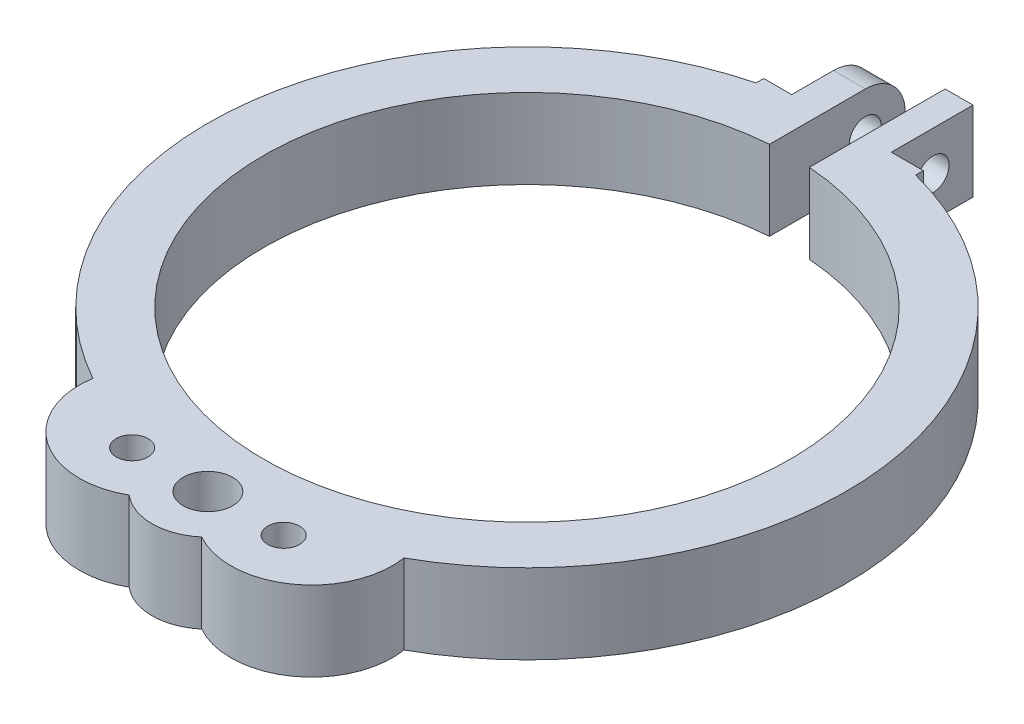
ISO-10303-21;
HEADER;
FILE_DESCRIPTION(('STEP AP214'),'2;1');
FILE_NAME('part.step','',(''),(''),'','','');
FILE_SCHEMA(('AUTOMOTIVE_DESIGN { 1 0 10303 214 1 1 1 1 }'));
ENDSEC;
DATA;
#1=APPLICATION_CONTEXT('core data for automotive mechanical design processes');
#2=APPLICATION_PROTOCOL_DEFINITION('international standard','automotive_design',2000,#1);
#3=PRODUCT_CONTEXT('',#1,'mechanical');
#4=PRODUCT('Part','Part','',(#3));
#5=PRODUCT_RELATED_PRODUCT_CATEGORY('part','',(#4));
#6=PRODUCT_DEFINITION_FORMATION('','',#4);
#7=PRODUCT_DEFINITION_CONTEXT('part definition',#1,'design');
#8=PRODUCT_DEFINITION('design','',#6,#7);
#9=PRODUCT_DEFINITION_SHAPE('','',#8);
#10=(LENGTH_UNIT() NAMED_UNIT(*) SI_UNIT(.MILLI.,.METRE.));
#11=(NAMED_UNIT(*) PLANE_ANGLE_UNIT() SI_UNIT($,.RADIAN.));
#12=(NAMED_UNIT(*) SI_UNIT($,.STERADIAN.) SOLID_ANGLE_UNIT());
#13=UNCERTAINTY_MEASURE_WITH_UNIT(LENGTH_MEASURE(1.E-05),#10,'distance_accuracy_value','');
#14=(GEOMETRIC_REPRESENTATION_CONTEXT(3) GLOBAL_UNCERTAINTY_ASSIGNED_CONTEXT((#13)) GLOBAL_UNIT_ASSIGNED_CONTEXT((#10,
#11,#12)) REPRESENTATION_CONTEXT('',''));
#15=CARTESIAN_POINT('',(0.,0.,0.));
#16=DIRECTION('',(0.,0.,1.));
#17=DIRECTION('',(1.,0.,0.));
#18=AXIS2_PLACEMENT_3D('',#15,#16,#17);
#19=CARTESIAN_POINT('',(0.,10.,-39.6862696659689));
#20=DIRECTION('',(0.,0.,-1.));
#21=DIRECTION('',(-1.,0.,0.));
#22=AXIS2_PLACEMENT_3D('',#19,#20,#21);
#23=PLANE('',#22);
#24=DIRECTION('',(1.,0.,0.));
#25=VECTOR('',#24,1.);
#26=CARTESIAN_POINT('',(0.,0.,-39.6862696659689));
#27=LINE('',#26,#25);
#28=CARTESIAN_POINT('',(6.,0.,-39.6862696659689));
#29=VERTEX_POINT('',#28);
#30=CARTESIAN_POINT('',(10.,0.,-39.6862696659689));
#31=VERTEX_POINT('',#30);
#32=EDGE_CURVE('E151',#29,#31,#27,.T.);
#33=ORIENTED_EDGE('',*,*,#32,.F.);
#34=DIRECTION('',(0.,-1.,0.));
#35=VECTOR('',#34,1.);
#36=CARTESIAN_POINT('',(6.,0.,-39.6862696659689));
#37=LINE('',#36,#35);
#38=CARTESIAN_POINT('',(6.,10.,-39.6862696659689));
#39=VERTEX_POINT('',#38);
#40=EDGE_CURVE('E159',#39,#29,#37,.T.);
#41=ORIENTED_EDGE('',*,*,#40,.F.);
#42=DIRECTION('',(1.,0.,0.));
#43=VECTOR('',#42,1.);
#44=CARTESIAN_POINT('',(0.,10.,-39.6862696659689));
#45=LINE('',#44,#43);
#46=CARTESIAN_POINT('',(10.,10.,-39.6862696659689));
#47=VERTEX_POINT('',#46);
#48=EDGE_CURVE('E256',#39,#47,#45,.T.);
#49=ORIENTED_EDGE('',*,*,#48,.T.);
#50=DIRECTION('',(0.,-1.,0.));
#51=VECTOR('',#50,1.);
#52=CARTESIAN_POINT('',(10.,10.,-39.6862696659689));
#53=LINE('',#52,#51);
#54=EDGE_CURVE('E171',#47,#31,#53,.T.);
#55=ORIENTED_EDGE('',*,*,#54,.T.);
#56=EDGE_LOOP('',(#33,#41,#49,#55));
#57=FACE_BOUND('',#56,.T.);
#58=ADVANCED_FACE('F35',(#57),#23,.T.);
#59=CARTESIAN_POINT('',(0.,10.,-39.6862696659689));
#60=DIRECTION('',(0.,0.,1.));
#61=DIRECTION('',(1.,0.,0.));
#62=AXIS2_PLACEMENT_3D('',#59,#60,#61);
#63=PLANE('',#62);
#64=DIRECTION('',(0.,-1.,0.));
#65=VECTOR('',#64,1.);
#66=CARTESIAN_POINT('',(-6.5,10.,-39.6862696659689));
#67=LINE('',#66,#65);
#68=CARTESIAN_POINT('',(-6.5,10.,-39.6862696659689));
#69=VERTEX_POINT('',#68);
#70=CARTESIAN_POINT('',(-6.5,0.,-39.6862696659689));
#71=VERTEX_POINT('',#70);
#72=EDGE_CURVE('E55',#69,#71,#67,.T.);
#73=ORIENTED_EDGE('',*,*,#72,.T.);
#74=DIRECTION('',(-1.,0.,0.));
#75=VECTOR('',#74,1.);
#76=CARTESIAN_POINT('',(0.,0.,-39.6862696659689));
#77=LINE('',#76,#75);
#78=CARTESIAN_POINT('',(-10.,0.,-39.6862696659689));
#79=VERTEX_POINT('',#78);
#80=EDGE_CURVE('E202',#71,#79,#77,.T.);
#81=ORIENTED_EDGE('',*,*,#80,.T.);
#82=DIRECTION('',(0.,-1.,0.));
#83=VECTOR('',#82,1.);
#84=CARTESIAN_POINT('',(-10.,10.,-39.6862696659689));
#85=LINE('',#84,#83);
#86=CARTESIAN_POINT('',(-10.,10.,-39.6862696659689));
#87=VERTEX_POINT('',#86);
#88=EDGE_CURVE('E44',#87,#79,#85,.T.);
#89=ORIENTED_EDGE('',*,*,#88,.F.);
#90=DIRECTION('',(-1.,0.,0.));
#91=VECTOR('',#90,1.);
#92=CARTESIAN_POINT('',(0.,10.,-39.6862696659689));
#93=LINE('',#92,#91);
#94=EDGE_CURVE('E51',#69,#87,#93,.T.);
#95=ORIENTED_EDGE('',*,*,#94,.F.);
#96=EDGE_LOOP('',(#73,#81,#89,#95));
#97=FACE_BOUND('',#96,.T.);
#98=ADVANCED_FACE('F352',(#97),#63,.F.);
#99=CARTESIAN_POINT('',(2.5,10.,0.));
#100=DIRECTION('',(-1.,0.,0.));
#101=DIRECTION('',(0.,0.,1.));
#102=AXIS2_PLACEMENT_3D('',#99,#100,#101);
#103=PLANE('',#102);
#104=DIRECTION('',(0.,0.,-1.));
#105=VECTOR('',#104,1.);
#106=CARTESIAN_POINT('',(2.5,0.,0.));
#107=LINE('',#106,#105);
#108=CARTESIAN_POINT('',(2.5,0.,-32.9051667675458));
#109=VERTEX_POINT('',#108);
#110=CARTESIAN_POINT('',(2.5,0.,-49.9217985566783));
#111=VERTEX_POINT('',#110);
#112=EDGE_CURVE('E173',#109,#111,#107,.T.);
#113=ORIENTED_EDGE('',*,*,#112,.F.);
#114=DIRECTION('',(0.,-1.,0.));
#115=VECTOR('',#114,1.);
#116=CARTESIAN_POINT('',(2.5,10.,-32.9051667675458));
#117=LINE('',#116,#115);
#118=CARTESIAN_POINT('',(2.5,10.,-32.9051667675458));
#119=VERTEX_POINT('',#118);
#120=EDGE_CURVE('E182',#119,#109,#117,.T.);
#121=ORIENTED_EDGE('',*,*,#120,.F.);
#122=DIRECTION('',(0.,0.,-1.));
#123=VECTOR('',#122,1.);
#124=CARTESIAN_POINT('',(2.5,10.,0.));
#125=LINE('',#124,#123);
#126=CARTESIAN_POINT('',(2.5,10.,-49.9217985566783));
#127=VERTEX_POINT('',#126);
#128=EDGE_CURVE('E184',#119,#127,#125,.T.);
#129=ORIENTED_EDGE('',*,*,#128,.T.);
#130=DIRECTION('',(0.,1.,0.));
#131=VECTOR('',#130,1.);
#132=CARTESIAN_POINT('',(2.5,10.,-49.9217985566783));
#133=LINE('',#132,#131);
#134=EDGE_CURVE('E334',#111,#127,#133,.T.);
#135=ORIENTED_EDGE('',*,*,#134,.F.);
#136=EDGE_LOOP('',(#113,#121,#129,#135));
#137=FACE_BOUND('',#136,.T.);
#138=CARTESIAN_POINT('',(2.5,5.,-44.9217985566783));
#139=DIRECTION('',(-1.,0.,0.));
#140=DIRECTION('',(0.,0.,1.));
#141=AXIS2_PLACEMENT_3D('',#138,#139,#140);
#142=CIRCLE('',#141,2.);
#143=CARTESIAN_POINT('',(2.5,5.,-42.9217985566783));
#144=VERTEX_POINT('',#143);
#145=EDGE_CURVE('E39',#144,#144,#142,.F.);
#146=ORIENTED_EDGE('',*,*,#145,.T.);
#147=EDGE_LOOP('',(#146));
#148=FACE_BOUND('',#147,.T.);
#149=ADVANCED_FACE('F357',(#137,#148),#103,.T.);
#150=CARTESIAN_POINT('',(0.,10.,0.));
#151=DIRECTION('',(0.,-1.,0.));
#152=DIRECTION('',(0.,0.,-1.));
#153=AXIS2_PLACEMENT_3D('',#150,#151,#152);
#154=CYLINDRICAL_SURFACE('',#153,40.);
#155=DIRECTION('',(0.,1.,0.));
#156=VECTOR('',#155,1.);
#157=CARTESIAN_POINT('',(-19.5008787346222,0.,34.9244288224956));
#158=LINE('',#157,#156);
#159=CARTESIAN_POINT('',(-19.5008787346222,0.,34.9244288224956));
#160=VERTEX_POINT('',#159);
#161=CARTESIAN_POINT('',(-19.5008787346222,10.,34.9244288224956));
#162=VERTEX_POINT('',#161);
#163=EDGE_CURVE('E214',#160,#162,#158,.T.);
#164=ORIENTED_EDGE('',*,*,#163,.T.);
#165=CARTESIAN_POINT('',(0.,10.,0.));
#166=DIRECTION('',(0.,1.,0.));
#167=DIRECTION('',(0.,0.,1.));
#168=AXIS2_PLACEMENT_3D('',#165,#166,#167);
#169=CIRCLE('',#168,40.);
#170=CARTESIAN_POINT('',(-10.,10.,-38.7298334620742));
#171=VERTEX_POINT('',#170);
#172=EDGE_CURVE('E251',#171,#162,#169,.T.);
#173=ORIENTED_EDGE('',*,*,#172,.F.);
#174=DIRECTION('',(0.,-1.,0.));
#175=VECTOR('',#174,1.);
#176=CARTESIAN_POINT('',(-10.,10.,-38.7298334620742));
#177=LINE('',#176,#175);
#178=CARTESIAN_POINT('',(-10.,0.,-38.7298334620742));
#179=VERTEX_POINT('',#178);
#180=EDGE_CURVE('E189',#171,#179,#177,.T.);
#181=ORIENTED_EDGE('',*,*,#180,.T.);
#182=CARTESIAN_POINT('',(0.,0.,0.));
#183=DIRECTION('',(0.,1.,0.));
#184=DIRECTION('',(0.,0.,1.));
#185=AXIS2_PLACEMENT_3D('',#182,#183,#184);
#186=CIRCLE('',#185,40.);
#187=EDGE_CURVE('E178',#179,#160,#186,.T.);
#188=ORIENTED_EDGE('',*,*,#187,.T.);
#189=EDGE_LOOP('',(#164,#173,#181,#188));
#190=FACE_BOUND('',#189,.T.);
#191=ADVANCED_FACE('F211',(#190),#154,.T.);
#192=CARTESIAN_POINT('',(0.,10.,0.));
#193=DIRECTION('',(0.,-1.,0.));
#194=DIRECTION('',(0.,0.,-1.));
#195=AXIS2_PLACEMENT_3D('',#192,#193,#194);
#196=CYLINDRICAL_SURFACE('',#195,33.);
#197=CARTESIAN_POINT('',(0.,0.,0.));
#198=DIRECTION('',(0.,1.,0.));
#199=DIRECTION('',(0.,0.,1.));
#200=AXIS2_PLACEMENT_3D('',#197,#198,#199);
#201=CIRCLE('',#200,33.);
#202=CARTESIAN_POINT('',(-2.5,0.,-32.9051667675458));
#203=VERTEX_POINT('',#202);
#204=EDGE_CURVE('E229',#203,#109,#201,.T.);
#205=ORIENTED_EDGE('',*,*,#204,.F.);
#206=DIRECTION('',(0.,-1.,0.));
#207=VECTOR('',#206,1.);
#208=CARTESIAN_POINT('',(-2.5,10.,-32.9051667675458));
#209=LINE('',#208,#207);
#210=CARTESIAN_POINT('',(-2.5,10.,-32.9051667675458));
#211=VERTEX_POINT('',#210);
#212=EDGE_CURVE('E11',#211,#203,#209,.T.);
#213=ORIENTED_EDGE('',*,*,#212,.F.);
#214=CARTESIAN_POINT('',(0.,10.,0.));
#215=DIRECTION('',(0.,1.,0.));
#216=DIRECTION('',(0.,0.,1.));
#217=AXIS2_PLACEMENT_3D('',#214,#215,#216);
#218=CIRCLE('',#217,33.);
#219=EDGE_CURVE('E176',#211,#119,#218,.T.);
#220=ORIENTED_EDGE('',*,*,#219,.T.);
#221=ORIENTED_EDGE('',*,*,#120,.T.);
#222=EDGE_LOOP('',(#205,#213,#220,#221));
#223=FACE_BOUND('',#222,.T.);
#224=ADVANCED_FACE('F37',(#223),#196,.F.);
#225=CARTESIAN_POINT('',(-2.5,10.,0.));
#226=DIRECTION('',(-1.,0.,0.));
#227=DIRECTION('',(0.,0.,1.));
#228=AXIS2_PLACEMENT_3D('',#225,#226,#227);
#229=PLANE('',#228);
#230=CARTESIAN_POINT('',(-2.5,5.,-44.9217985566783));
#231=DIRECTION('',(1.,0.,0.));
#232=DIRECTION('',(0.,0.,-1.));
#233=AXIS2_PLACEMENT_3D('',#230,#231,#232);
#234=CIRCLE('',#233,2.);
#235=CARTESIAN_POINT('',(-2.5,5.,-46.9217985566783));
#236=VERTEX_POINT('',#235);
#237=EDGE_CURVE('E278',#236,#236,#234,.T.);
#238=ORIENTED_EDGE('',*,*,#237,.F.);
#239=EDGE_LOOP('',(#238));
#240=FACE_BOUND('',#239,.T.);
#241=DIRECTION('',(0.,0.,-1.));
#242=VECTOR('',#241,1.);
#243=CARTESIAN_POINT('',(-2.5,0.,0.));
#244=LINE('',#243,#242);
#245=CARTESIAN_POINT('',(-2.5,0.,-44.9217985566783));
#246=VERTEX_POINT('',#245);
#247=EDGE_CURVE('E207',#203,#246,#244,.T.);
#248=ORIENTED_EDGE('',*,*,#247,.T.);
#249=CARTESIAN_POINT('',(-2.5,5.,-44.9217985566783));
#250=DIRECTION('',(1.,0.,0.));
#251=DIRECTION('',(0.,0.,-1.));
#252=AXIS2_PLACEMENT_3D('',#249,#250,#251);
#253=CIRCLE('',#252,5.);
#254=CARTESIAN_POINT('',(-2.5,10.,-44.9217985566783));
#255=VERTEX_POINT('',#254);
#256=EDGE_CURVE('E265',#246,#255,#253,.T.);
#257=ORIENTED_EDGE('',*,*,#256,.T.);
#258=DIRECTION('',(0.,0.,-1.));
#259=VECTOR('',#258,1.);
#260=CARTESIAN_POINT('',(-2.5,10.,0.));
#261=LINE('',#260,#259);
#262=EDGE_CURVE('E245',#211,#255,#261,.T.);
#263=ORIENTED_EDGE('',*,*,#262,.F.);
#264=ORIENTED_EDGE('',*,*,#212,.T.);
#265=EDGE_LOOP('',(#248,#257,#263,#264));
#266=FACE_BOUND('',#265,.T.);
#267=ADVANCED_FACE('F263',(#240,#266),#229,.F.);
#268=CARTESIAN_POINT('',(-10.,10.,0.));
#269=DIRECTION('',(1.,0.,0.));
#270=DIRECTION('',(0.,0.,-1.));
#271=AXIS2_PLACEMENT_3D('',#268,#269,#270);
#272=PLANE('',#271);
#273=DIRECTION('',(0.,0.,1.));
#274=VECTOR('',#273,1.);
#275=CARTESIAN_POINT('',(-10.,0.,0.));
#276=LINE('',#275,#274);
#277=EDGE_CURVE('E198',#79,#179,#276,.T.);
#278=ORIENTED_EDGE('',*,*,#277,.T.);
#279=ORIENTED_EDGE('',*,*,#180,.F.);
#280=DIRECTION('',(0.,0.,1.));
#281=VECTOR('',#280,1.);
#282=CARTESIAN_POINT('',(-10.,10.,0.));
#283=LINE('',#282,#281);
#284=EDGE_CURVE('E199',#87,#171,#283,.T.);
#285=ORIENTED_EDGE('',*,*,#284,.F.);
#286=ORIENTED_EDGE('',*,*,#88,.T.);
#287=EDGE_LOOP('',(#278,#279,#285,#286));
#288=FACE_BOUND('',#287,.T.);
#289=ADVANCED_FACE('F196',(#288),#272,.F.);
#290=CARTESIAN_POINT('',(19.5008787346221,10.,34.9244288224956));
#291=VERTEX_POINT('',#290);
#292=CARTESIAN_POINT('',(10.,10.,-38.7298334620742));
#293=VERTEX_POINT('',#292);
#294=EDGE_CURVE('E250',#291,#293,#169,.T.);
#295=ORIENTED_EDGE('',*,*,#294,.F.);
#296=DIRECTION('',(0.,1.,0.));
#297=VECTOR('',#296,1.);
#298=CARTESIAN_POINT('',(19.5008787346221,0.,34.9244288224956));
#299=LINE('',#298,#297);
#300=CARTESIAN_POINT('',(19.5008787346221,0.,34.9244288224956));
#301=VERTEX_POINT('',#300);
#302=EDGE_CURVE('E230',#301,#291,#299,.T.);
#303=ORIENTED_EDGE('',*,*,#302,.F.);
#304=CARTESIAN_POINT('',(10.,0.,-38.7298334620742));
#305=VERTEX_POINT('',#304);
#306=EDGE_CURVE('E205',#301,#305,#186,.T.);
#307=ORIENTED_EDGE('',*,*,#306,.T.);
#308=DIRECTION('',(0.,-1.,0.));
#309=VECTOR('',#308,1.);
#310=CARTESIAN_POINT('',(10.,10.,-38.7298334620742));
#311=LINE('',#310,#309);
#312=EDGE_CURVE('E186',#293,#305,#311,.T.);
#313=ORIENTED_EDGE('',*,*,#312,.F.);
#314=EDGE_LOOP('',(#295,#303,#307,#313));
#315=FACE_BOUND('',#314,.T.);
#316=ADVANCED_FACE('F313',(#315),#154,.T.);
#317=CARTESIAN_POINT('',(10.,10.,0.));
#318=DIRECTION('',(1.,0.,0.));
#319=DIRECTION('',(0.,0.,-1.));
#320=AXIS2_PLACEMENT_3D('',#317,#318,#319);
#321=PLANE('',#320);
#322=DIRECTION('',(0.,0.,1.));
#323=VECTOR('',#322,1.);
#324=CARTESIAN_POINT('',(10.,0.,0.));
#325=LINE('',#324,#323);
#326=EDGE_CURVE('E174',#31,#305,#325,.T.);
#327=ORIENTED_EDGE('',*,*,#326,.F.);
#328=ORIENTED_EDGE('',*,*,#54,.F.);
#329=DIRECTION('',(0.,0.,1.));
#330=VECTOR('',#329,1.);
#331=CARTESIAN_POINT('',(10.,10.,0.));
#332=LINE('',#331,#330);
#333=EDGE_CURVE('E253',#47,#293,#332,.T.);
#334=ORIENTED_EDGE('',*,*,#333,.T.);
#335=ORIENTED_EDGE('',*,*,#312,.T.);
#336=EDGE_LOOP('',(#327,#328,#334,#335));
#337=FACE_BOUND('',#336,.T.);
#338=ADVANCED_FACE('F315',(#337),#321,.T.);
#339=CARTESIAN_POINT('',(0.,10.,0.));
#340=DIRECTION('',(0.,1.,0.));
#341=DIRECTION('',(0.,0.,1.));
#342=AXIS2_PLACEMENT_3D('',#339,#340,#341);
#343=PLANE('',#342);
#344=CARTESIAN_POINT('',(0.,10.,40.));
#345=DIRECTION('',(0.,1.,0.));
#346=DIRECTION('',(0.,0.,1.));
#347=AXIS2_PLACEMENT_3D('',#344,#345,#346);
#348=CIRCLE('',#347,3.1);
#349=CARTESIAN_POINT('',(0.,10.,43.1));
#350=VERTEX_POINT('',#349);
#351=EDGE_CURVE('E272',#350,#350,#348,.T.);
#352=ORIENTED_EDGE('',*,*,#351,.F.);
#353=EDGE_LOOP('',(#352));
#354=FACE_BOUND('',#353,.T.);
#355=CARTESIAN_POINT('',(-9.50000000000001,10.,40.));
#356=DIRECTION('',(0.,1.,0.));
#357=DIRECTION('',(0.,0.,1.));
#358=AXIS2_PLACEMENT_3D('',#355,#356,#357);
#359=CIRCLE('',#358,2.);
#360=CARTESIAN_POINT('',(-9.50000000000001,10.,42.));
#361=VERTEX_POINT('',#360);
#362=EDGE_CURVE('E283',#361,#361,#359,.T.);
#363=ORIENTED_EDGE('',*,*,#362,.F.);
#364=EDGE_LOOP('',(#363));
#365=FACE_BOUND('',#364,.T.);
#366=CARTESIAN_POINT('',(9.5,10.,40.));
#367=DIRECTION('',(0.,1.,0.));
#368=DIRECTION('',(0.,0.,1.));
#369=AXIS2_PLACEMENT_3D('',#366,#367,#368);
#370=CIRCLE('',#369,2.);
#371=CARTESIAN_POINT('',(9.5,10.,42.));
#372=VERTEX_POINT('',#371);
#373=EDGE_CURVE('E288',#372,#372,#370,.T.);
#374=ORIENTED_EDGE('',*,*,#373,.F.);
#375=EDGE_LOOP('',(#374));
#376=FACE_BOUND('',#375,.T.);
#377=ORIENTED_EDGE('',*,*,#219,.F.);
#378=ORIENTED_EDGE('',*,*,#262,.T.);
#379=DIRECTION('',(1.,0.,0.));
#380=VECTOR('',#379,1.);
#381=CARTESIAN_POINT('',(-5.,10.,-44.9217985566783));
#382=LINE('',#381,#380);
#383=CARTESIAN_POINT('',(-6.5,10.,-44.9217985566783));
#384=VERTEX_POINT('',#383);
#385=EDGE_CURVE('E273',#384,#255,#382,.T.);
#386=ORIENTED_EDGE('',*,*,#385,.F.);
#387=DIRECTION('',(0.,0.,1.));
#388=VECTOR('',#387,1.);
#389=CARTESIAN_POINT('',(-6.5,10.,-44.9217985566783));
#390=LINE('',#389,#388);
#391=EDGE_CURVE('E319',#384,#69,#390,.T.);
#392=ORIENTED_EDGE('',*,*,#391,.T.);
#393=ORIENTED_EDGE('',*,*,#94,.T.);
#394=ORIENTED_EDGE('',*,*,#284,.T.);
#395=ORIENTED_EDGE('',*,*,#172,.T.);
#396=CARTESIAN_POINT('',(-9.50000000000001,10.,36.5));
#397=DIRECTION('',(0.,1.,0.));
#398=DIRECTION('',(0.,0.,1.));
#399=AXIS2_PLACEMENT_3D('',#396,#397,#398);
#400=CIRCLE('',#399,10.1242283656583);
#401=CARTESIAN_POINT('',(-4.54146341463415,10.,45.3268292682927));
#402=VERTEX_POINT('',#401);
#403=EDGE_CURVE('E228',#402,#162,#400,.F.);
#404=ORIENTED_EDGE('',*,*,#403,.F.);
#405=CARTESIAN_POINT('',(0.,10.,40.));
#406=DIRECTION('',(0.,1.,0.));
#407=DIRECTION('',(0.,0.,1.));
#408=AXIS2_PLACEMENT_3D('',#405,#406,#407);
#409=CIRCLE('',#408,6.99999999999999);
#410=CARTESIAN_POINT('',(4.54146341463413,10.,45.3268292682927));
#411=VERTEX_POINT('',#410);
#412=EDGE_CURVE('E299',#402,#411,#409,.T.);
#413=ORIENTED_EDGE('',*,*,#412,.T.);
#414=CARTESIAN_POINT('',(9.5,10.,36.5));
#415=DIRECTION('',(0.,1.,0.));
#416=DIRECTION('',(0.,0.,1.));
#417=AXIS2_PLACEMENT_3D('',#414,#415,#416);
#418=CIRCLE('',#417,10.1242283656583);
#419=EDGE_CURVE('E223',#411,#291,#418,.T.);
#420=ORIENTED_EDGE('',*,*,#419,.T.);
#421=ORIENTED_EDGE('',*,*,#294,.T.);
#422=ORIENTED_EDGE('',*,*,#333,.F.);
#423=ORIENTED_EDGE('',*,*,#48,.F.);
#424=DIRECTION('',(0.,0.,1.));
#425=VECTOR('',#424,1.);
#426=CARTESIAN_POINT('',(6.,10.,-39.6862696659689));
#427=LINE('',#426,#425);
#428=CARTESIAN_POINT('',(6.,10.,-49.9217985566783));
#429=VERTEX_POINT('',#428);
#430=EDGE_CURVE('E165',#429,#39,#427,.T.);
#431=ORIENTED_EDGE('',*,*,#430,.F.);
#432=DIRECTION('',(1.,0.,0.));
#433=VECTOR('',#432,1.);
#434=CARTESIAN_POINT('',(5.,10.,-49.9217985566783));
#435=LINE('',#434,#433);
#436=EDGE_CURVE('E318',#127,#429,#435,.T.);
#437=ORIENTED_EDGE('',*,*,#436,.F.);
#438=ORIENTED_EDGE('',*,*,#128,.F.);
#439=EDGE_LOOP('',(#377,#378,#386,#392,#393,#394,#395,#404,#413,#420,#421,#422,#423,#431,#437,#438));
#440=FACE_BOUND('',#439,.T.);
#441=ADVANCED_FACE('F306',(#354,#365,#376,#440),#343,.T.);
#442=CARTESIAN_POINT('',(0.,0.,0.));
#443=DIRECTION('',(0.,1.,0.));
#444=DIRECTION('',(0.,0.,1.));
#445=AXIS2_PLACEMENT_3D('',#442,#443,#444);
#446=PLANE('',#445);
#447=CARTESIAN_POINT('',(0.,0.,40.));
#448=DIRECTION('',(0.,1.,0.));
#449=DIRECTION('',(0.,0.,1.));
#450=AXIS2_PLACEMENT_3D('',#447,#448,#449);
#451=CIRCLE('',#450,3.1);
#452=CARTESIAN_POINT('',(0.,0.,43.1));
#453=VERTEX_POINT('',#452);
#454=EDGE_CURVE('E276',#453,#453,#451,.T.);
#455=ORIENTED_EDGE('',*,*,#454,.T.);
#456=EDGE_LOOP('',(#455));
#457=FACE_BOUND('',#456,.T.);
#458=CARTESIAN_POINT('',(-9.50000000000001,0.,40.));
#459=DIRECTION('',(0.,1.,0.));
#460=DIRECTION('',(0.,0.,1.));
#461=AXIS2_PLACEMENT_3D('',#458,#459,#460);
#462=CIRCLE('',#461,2.);
#463=CARTESIAN_POINT('',(-9.50000000000001,0.,42.));
#464=VERTEX_POINT('',#463);
#465=EDGE_CURVE('E285',#464,#464,#462,.T.);
#466=ORIENTED_EDGE('',*,*,#465,.T.);
#467=EDGE_LOOP('',(#466));
#468=FACE_BOUND('',#467,.T.);
#469=CARTESIAN_POINT('',(9.5,0.,40.));
#470=DIRECTION('',(0.,1.,0.));
#471=DIRECTION('',(0.,0.,1.));
#472=AXIS2_PLACEMENT_3D('',#469,#470,#471);
#473=CIRCLE('',#472,2.);
#474=CARTESIAN_POINT('',(9.5,0.,42.));
#475=VERTEX_POINT('',#474);
#476=EDGE_CURVE('E291',#475,#475,#473,.T.);
#477=ORIENTED_EDGE('',*,*,#476,.T.);
#478=EDGE_LOOP('',(#477));
#479=FACE_BOUND('',#478,.T.);
#480=ORIENTED_EDGE('',*,*,#204,.T.);
#481=ORIENTED_EDGE('',*,*,#112,.T.);
#482=DIRECTION('',(-1.,0.,0.));
#483=VECTOR('',#482,1.);
#484=CARTESIAN_POINT('',(5.,0.,-49.9217985566783));
#485=LINE('',#484,#483);
#486=CARTESIAN_POINT('',(6.,0.,-49.9217985566783));
#487=VERTEX_POINT('',#486);
#488=EDGE_CURVE('E154',#487,#111,#485,.T.);
#489=ORIENTED_EDGE('',*,*,#488,.F.);
#490=DIRECTION('',(0.,0.,-1.));
#491=VECTOR('',#490,1.);
#492=CARTESIAN_POINT('',(6.,0.,-49.9217985566783));
#493=LINE('',#492,#491);
#494=EDGE_CURVE('E145',#29,#487,#493,.T.);
#495=ORIENTED_EDGE('',*,*,#494,.F.);
#496=ORIENTED_EDGE('',*,*,#32,.T.);
#497=ORIENTED_EDGE('',*,*,#326,.T.);
#498=ORIENTED_EDGE('',*,*,#306,.F.);
#499=CARTESIAN_POINT('',(9.5,0.,36.5));
#500=DIRECTION('',(0.,1.,0.));
#501=DIRECTION('',(0.,0.,1.));
#502=AXIS2_PLACEMENT_3D('',#499,#500,#501);
#503=CIRCLE('',#502,10.1242283656583);
#504=CARTESIAN_POINT('',(4.54146341463413,0.,45.3268292682927));
#505=VERTEX_POINT('',#504);
#506=EDGE_CURVE('E242',#505,#301,#503,.T.);
#507=ORIENTED_EDGE('',*,*,#506,.F.);
#508=CARTESIAN_POINT('',(0.,0.,40.));
#509=DIRECTION('',(0.,1.,0.));
#510=DIRECTION('',(0.,0.,1.));
#511=AXIS2_PLACEMENT_3D('',#508,#509,#510);
#512=CIRCLE('',#511,6.99999999999999);
#513=CARTESIAN_POINT('',(-4.54146341463415,0.,45.3268292682927));
#514=VERTEX_POINT('',#513);
#515=EDGE_CURVE('E221',#514,#505,#512,.T.);
#516=ORIENTED_EDGE('',*,*,#515,.F.);
#517=CARTESIAN_POINT('',(-9.50000000000001,0.,36.5));
#518=DIRECTION('',(0.,1.,0.));
#519=DIRECTION('',(0.,0.,1.));
#520=AXIS2_PLACEMENT_3D('',#517,#518,#519);
#521=CIRCLE('',#520,10.1242283656583);
#522=EDGE_CURVE('E218',#514,#160,#521,.F.);
#523=ORIENTED_EDGE('',*,*,#522,.T.);
#524=ORIENTED_EDGE('',*,*,#187,.F.);
#525=ORIENTED_EDGE('',*,*,#277,.F.);
#526=ORIENTED_EDGE('',*,*,#80,.F.);
#527=DIRECTION('',(0.,0.,-1.));
#528=VECTOR('',#527,1.);
#529=CARTESIAN_POINT('',(-6.5,0.,-39.6862696659689));
#530=LINE('',#529,#528);
#531=CARTESIAN_POINT('',(-6.5,0.,-44.9217985566783));
#532=VERTEX_POINT('',#531);
#533=EDGE_CURVE('E268',#71,#532,#530,.T.);
#534=ORIENTED_EDGE('',*,*,#533,.T.);
#535=DIRECTION('',(-1.,0.,0.));
#536=VECTOR('',#535,1.);
#537=CARTESIAN_POINT('',(-5.,0.,-44.9217985566783));
#538=LINE('',#537,#536);
#539=EDGE_CURVE('E267',#246,#532,#538,.T.);
#540=ORIENTED_EDGE('',*,*,#539,.F.);
#541=ORIENTED_EDGE('',*,*,#247,.F.);
#542=EDGE_LOOP('',(#480,#481,#489,#495,#496,#497,#498,#507,#516,#523,#524,#525,#526,#534,#540,#541));
#543=FACE_BOUND('',#542,.T.);
#544=ADVANCED_FACE('F148',(#457,#468,#479,#543),#446,.F.);
#545=CARTESIAN_POINT('',(-9.50000000000001,0.,36.5));
#546=DIRECTION('',(0.,1.,0.));
#547=DIRECTION('',(0.,0.,1.));
#548=AXIS2_PLACEMENT_3D('',#545,#546,#547);
#549=CYLINDRICAL_SURFACE('',#548,10.1242283656583);
#550=ORIENTED_EDGE('',*,*,#403,.T.);
#551=ORIENTED_EDGE('',*,*,#163,.F.);
#552=ORIENTED_EDGE('',*,*,#522,.F.);
#553=DIRECTION('',(0.,1.,0.));
#554=VECTOR('',#553,1.);
#555=CARTESIAN_POINT('',(-4.54146341463415,0.,45.3268292682927));
#556=LINE('',#555,#554);
#557=EDGE_CURVE('E240',#514,#402,#556,.T.);
#558=ORIENTED_EDGE('',*,*,#557,.T.);
#559=EDGE_LOOP('',(#550,#551,#552,#558));
#560=FACE_BOUND('',#559,.T.);
#561=ADVANCED_FACE('F226',(#560),#549,.T.);
#562=CARTESIAN_POINT('',(9.5,0.,36.5));
#563=DIRECTION('',(0.,1.,0.));
#564=DIRECTION('',(0.,0.,1.));
#565=AXIS2_PLACEMENT_3D('',#562,#563,#564);
#566=CYLINDRICAL_SURFACE('',#565,10.1242283656583);
#567=ORIENTED_EDGE('',*,*,#419,.F.);
#568=DIRECTION('',(0.,1.,0.));
#569=VECTOR('',#568,1.);
#570=CARTESIAN_POINT('',(4.54146341463413,0.,45.3268292682927));
#571=LINE('',#570,#569);
#572=EDGE_CURVE('E234',#505,#411,#571,.T.);
#573=ORIENTED_EDGE('',*,*,#572,.F.);
#574=ORIENTED_EDGE('',*,*,#506,.T.);
#575=ORIENTED_EDGE('',*,*,#302,.T.);
#576=EDGE_LOOP('',(#567,#573,#574,#575));
#577=FACE_BOUND('',#576,.T.);
#578=ADVANCED_FACE('F310',(#577),#566,.T.);
#579=CARTESIAN_POINT('',(0.,0.,40.));
#580=DIRECTION('',(0.,1.,0.));
#581=DIRECTION('',(0.,0.,1.));
#582=AXIS2_PLACEMENT_3D('',#579,#580,#581);
#583=CYLINDRICAL_SURFACE('',#582,6.99999999999999);
#584=ORIENTED_EDGE('',*,*,#412,.F.);
#585=ORIENTED_EDGE('',*,*,#557,.F.);
#586=ORIENTED_EDGE('',*,*,#515,.T.);
#587=ORIENTED_EDGE('',*,*,#572,.T.);
#588=EDGE_LOOP('',(#584,#585,#586,#587));
#589=FACE_BOUND('',#588,.T.);
#590=ADVANCED_FACE('F415',(#589),#583,.T.);
#591=CARTESIAN_POINT('',(9.5,0.,40.));
#592=DIRECTION('',(0.,1.,0.));
#593=DIRECTION('',(0.,0.,1.));
#594=AXIS2_PLACEMENT_3D('',#591,#592,#593);
#595=CYLINDRICAL_SURFACE('',#594,2.);
#596=ORIENTED_EDGE('',*,*,#476,.F.);
#597=EDGE_LOOP('',(#596));
#598=FACE_BOUND('',#597,.T.);
#599=ORIENTED_EDGE('',*,*,#373,.T.);
#600=EDGE_LOOP('',(#599));
#601=FACE_BOUND('',#600,.T.);
#602=ADVANCED_FACE('F411',(#598,#601),#595,.F.);
#603=CARTESIAN_POINT('',(-9.50000000000001,0.,40.));
#604=DIRECTION('',(0.,1.,0.));
#605=DIRECTION('',(0.,0.,1.));
#606=AXIS2_PLACEMENT_3D('',#603,#604,#605);
#607=CYLINDRICAL_SURFACE('',#606,2.);
#608=ORIENTED_EDGE('',*,*,#465,.F.);
#609=EDGE_LOOP('',(#608));
#610=FACE_BOUND('',#609,.T.);
#611=ORIENTED_EDGE('',*,*,#362,.T.);
#612=EDGE_LOOP('',(#611));
#613=FACE_BOUND('',#612,.T.);
#614=ADVANCED_FACE('F407',(#610,#613),#607,.F.);
#615=CARTESIAN_POINT('',(0.,0.,40.));
#616=DIRECTION('',(0.,1.,0.));
#617=DIRECTION('',(0.,0.,1.));
#618=AXIS2_PLACEMENT_3D('',#615,#616,#617);
#619=CYLINDRICAL_SURFACE('',#618,3.1);
#620=ORIENTED_EDGE('',*,*,#454,.F.);
#621=EDGE_LOOP('',(#620));
#622=FACE_BOUND('',#621,.T.);
#623=ORIENTED_EDGE('',*,*,#351,.T.);
#624=EDGE_LOOP('',(#623));
#625=FACE_BOUND('',#624,.T.);
#626=ADVANCED_FACE('F404',(#622,#625),#619,.F.);
#627=CARTESIAN_POINT('',(-10.6568542494924,5.,-44.9217985566783));
#628=DIRECTION('',(1.,0.,0.));
#629=DIRECTION('',(0.,0.,-1.));
#630=AXIS2_PLACEMENT_3D('',#627,#628,#629);
#631=CYLINDRICAL_SURFACE('',#630,2.);
#632=ORIENTED_EDGE('',*,*,#237,.T.);
#633=EDGE_LOOP('',(#632));
#634=FACE_BOUND('',#633,.T.);
#635=CARTESIAN_POINT('',(-6.5,5.,-44.9217985566783));
#636=DIRECTION('',(1.,0.,0.));
#637=DIRECTION('',(0.,0.,-1.));
#638=AXIS2_PLACEMENT_3D('',#635,#636,#637);
#639=CIRCLE('',#638,2.);
#640=CARTESIAN_POINT('',(-6.5,5.,-46.9217985566783));
#641=VERTEX_POINT('',#640);
#642=EDGE_CURVE('E326',#641,#641,#639,.T.);
#643=ORIENTED_EDGE('',*,*,#642,.F.);
#644=EDGE_LOOP('',(#643));
#645=FACE_BOUND('',#644,.T.);
#646=ADVANCED_FACE('F340',(#634,#645),#631,.F.);
#647=CARTESIAN_POINT('',(0.,0.,-49.9217985566783));
#648=DIRECTION('',(0.,0.,-1.));
#649=DIRECTION('',(-1.,0.,0.));
#650=AXIS2_PLACEMENT_3D('',#647,#648,#649);
#651=PLANE('',#650);
#652=ORIENTED_EDGE('',*,*,#436,.T.);
#653=DIRECTION('',(0.,1.,0.));
#654=VECTOR('',#653,1.);
#655=CARTESIAN_POINT('',(6.,10.,-49.9217985566783));
#656=LINE('',#655,#654);
#657=EDGE_CURVE('E158',#487,#429,#656,.T.);
#658=ORIENTED_EDGE('',*,*,#657,.F.);
#659=ORIENTED_EDGE('',*,*,#488,.T.);
#660=ORIENTED_EDGE('',*,*,#134,.T.);
#661=EDGE_LOOP('',(#652,#658,#659,#660));
#662=FACE_BOUND('',#661,.T.);
#663=ADVANCED_FACE('F383',(#662),#651,.T.);
#664=CARTESIAN_POINT('',(7.5,5.,-44.9217985566783));
#665=DIRECTION('',(-1.,0.,0.));
#666=DIRECTION('',(0.,0.,1.));
#667=AXIS2_PLACEMENT_3D('',#664,#665,#666);
#668=CYLINDRICAL_SURFACE('',#667,2.);
#669=ORIENTED_EDGE('',*,*,#145,.F.);
#670=EDGE_LOOP('',(#669));
#671=FACE_BOUND('',#670,.T.);
#672=CARTESIAN_POINT('',(6.,5.,-44.9217985566783));
#673=DIRECTION('',(1.,0.,0.));
#674=DIRECTION('',(0.,0.,-1.));
#675=AXIS2_PLACEMENT_3D('',#672,#673,#674);
#676=CIRCLE('',#675,2.);
#677=CARTESIAN_POINT('',(6.,5.,-46.9217985566783));
#678=VERTEX_POINT('',#677);
#679=EDGE_CURVE('E168',#678,#678,#676,.T.);
#680=ORIENTED_EDGE('',*,*,#679,.T.);
#681=EDGE_LOOP('',(#680));
#682=FACE_BOUND('',#681,.T.);
#683=ADVANCED_FACE('F379',(#671,#682),#668,.F.);
#684=CARTESIAN_POINT('',(-6.5,5.,-44.9217985566783));
#685=DIRECTION('',(1.,0.,0.));
#686=DIRECTION('',(0.,0.,-1.));
#687=AXIS2_PLACEMENT_3D('',#684,#685,#686);
#688=CYLINDRICAL_SURFACE('',#687,5.);
#689=CARTESIAN_POINT('',(-6.5,5.,-44.9217985566783));
#690=DIRECTION('',(1.,0.,0.));
#691=DIRECTION('',(0.,0.,-1.));
#692=AXIS2_PLACEMENT_3D('',#689,#690,#691);
#693=CIRCLE('',#692,5.);
#694=EDGE_CURVE('E330',#532,#384,#693,.T.);
#695=ORIENTED_EDGE('',*,*,#694,.T.);
#696=ORIENTED_EDGE('',*,*,#385,.T.);
#697=ORIENTED_EDGE('',*,*,#256,.F.);
#698=ORIENTED_EDGE('',*,*,#539,.T.);
#699=EDGE_LOOP('',(#695,#696,#697,#698));
#700=FACE_BOUND('',#699,.T.);
#701=ADVANCED_FACE('F382',(#700),#688,.T.);
#702=CARTESIAN_POINT('',(-6.5,5.,-44.9217985566783));
#703=DIRECTION('',(1.,0.,0.));
#704=DIRECTION('',(0.,0.,-1.));
#705=AXIS2_PLACEMENT_3D('',#702,#703,#704);
#706=PLANE('',#705);
#707=ORIENTED_EDGE('',*,*,#642,.T.);
#708=EDGE_LOOP('',(#707));
#709=FACE_BOUND('',#708,.T.);
#710=ORIENTED_EDGE('',*,*,#694,.F.);
#711=ORIENTED_EDGE('',*,*,#533,.F.);
#712=ORIENTED_EDGE('',*,*,#72,.F.);
#713=ORIENTED_EDGE('',*,*,#391,.F.);
#714=EDGE_LOOP('',(#710,#711,#712,#713));
#715=FACE_BOUND('',#714,.T.);
#716=ADVANCED_FACE('F389',(#709,#715),#706,.F.);
#717=CARTESIAN_POINT('',(6.,0.,0.));
#718=DIRECTION('',(-1.,0.,0.));
#719=DIRECTION('',(0.,0.,1.));
#720=AXIS2_PLACEMENT_3D('',#717,#718,#719);
#721=PLANE('',#720);
#722=ORIENTED_EDGE('',*,*,#40,.T.);
#723=ORIENTED_EDGE('',*,*,#494,.T.);
#724=ORIENTED_EDGE('',*,*,#657,.T.);
#725=ORIENTED_EDGE('',*,*,#430,.T.);
#726=EDGE_LOOP('',(#722,#723,#724,#725));
#727=FACE_BOUND('',#726,.T.);
#728=ORIENTED_EDGE('',*,*,#679,.F.);
#729=EDGE_LOOP('',(#728));
#730=FACE_BOUND('',#729,.T.);
#731=ADVANCED_FACE('F162',(#727,#730),#721,.F.);
#732=CLOSED_SHELL('',(#58,#98,#149,#191,#224,#267,#289,#316,#338,#441,#544,#561,#578,#590,#602,
#614,#626,#646,#663,#683,#701,#716,#731));
#733=MANIFOLD_SOLID_BREP('B2',#732);
#734=ADVANCED_BREP_SHAPE_REPRESENTATION('',(#18,#733),#14);
#735=SHAPE_DEFINITION_REPRESENTATION(#9,#734);
ENDSEC;
END-ISO-10303-21;
